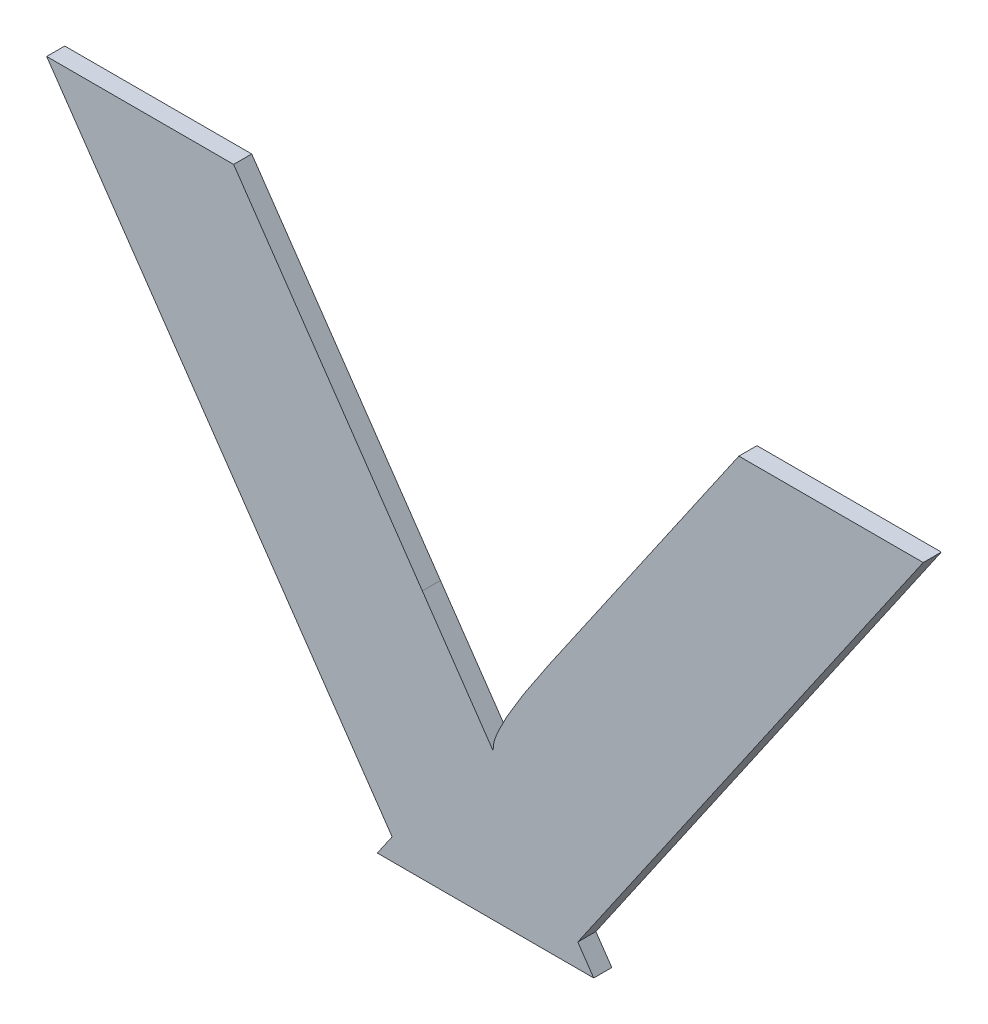
ISO-10303-21;
HEADER;
FILE_DESCRIPTION(('STEP AP214'),'2;1');
FILE_NAME('part.step','',(''),(''),'','','');
FILE_SCHEMA(('AUTOMOTIVE_DESIGN { 1 0 10303 214 1 1 1 1 }'));
ENDSEC;
DATA;
#1=APPLICATION_CONTEXT('core data for automotive mechanical design processes');
#2=APPLICATION_PROTOCOL_DEFINITION('international standard','automotive_design',2000,#1);
#3=PRODUCT_CONTEXT('',#1,'mechanical');
#4=PRODUCT('Part','Part','',(#3));
#5=PRODUCT_RELATED_PRODUCT_CATEGORY('part','',(#4));
#6=PRODUCT_DEFINITION_FORMATION('','',#4);
#7=PRODUCT_DEFINITION_CONTEXT('part definition',#1,'design');
#8=PRODUCT_DEFINITION('design','',#6,#7);
#9=PRODUCT_DEFINITION_SHAPE('','',#8);
#10=(LENGTH_UNIT() NAMED_UNIT(*) SI_UNIT(.MILLI.,.METRE.));
#11=(NAMED_UNIT(*) PLANE_ANGLE_UNIT() SI_UNIT($,.RADIAN.));
#12=(NAMED_UNIT(*) SI_UNIT($,.STERADIAN.) SOLID_ANGLE_UNIT());
#13=UNCERTAINTY_MEASURE_WITH_UNIT(LENGTH_MEASURE(1.E-05),#10,'distance_accuracy_value','');
#14=(GEOMETRIC_REPRESENTATION_CONTEXT(3) GLOBAL_UNCERTAINTY_ASSIGNED_CONTEXT((#13)) GLOBAL_UNIT_ASSIGNED_CONTEXT((#10,
#11,#12)) REPRESENTATION_CONTEXT('',''));
#15=CARTESIAN_POINT('',(0.,0.,0.));
#16=DIRECTION('',(0.,0.,1.));
#17=DIRECTION('',(1.,0.,0.));
#18=AXIS2_PLACEMENT_3D('',#15,#16,#17);
#19=CARTESIAN_POINT('',(13.6658653846154,-15.,0.5));
#20=DIRECTION('',(-0.824274658722889,-0.566190150909803,0.));
#21=DIRECTION('',(0.566190150909803,-0.824274658722889,0.));
#22=AXIS2_PLACEMENT_3D('',#19,#20,#21);
#23=PLANE('',#22);
#24=DIRECTION('',(-0.566190150909803,0.824274658722889,0.));
#25=VECTOR('',#24,1.);
#26=CARTESIAN_POINT('',(13.6658653846154,-15.,0.5));
#27=LINE('',#26,#25);
#28=CARTESIAN_POINT('',(3.01899271149552,0.499999999999999,0.5));
#29=VERTEX_POINT('',#28);
#30=CARTESIAN_POINT('',(2.57812500000002,1.14182692307692,0.5));
#31=VERTEX_POINT('',#30);
#32=EDGE_CURVE('E140',#29,#31,#27,.T.);
#33=ORIENTED_EDGE('',*,*,#32,.F.);
#34=DIRECTION('',(0.,0.,-1.));
#35=VECTOR('',#34,1.);
#36=CARTESIAN_POINT('',(3.01899271149552,0.5,0.5));
#37=LINE('',#36,#35);
#38=CARTESIAN_POINT('',(3.01899271149552,0.500000000000001,0.));
#39=VERTEX_POINT('',#38);
#40=EDGE_CURVE('E53',#29,#39,#37,.T.);
#41=ORIENTED_EDGE('',*,*,#40,.T.);
#42=DIRECTION('',(-0.566190150909803,0.824274658722889,0.));
#43=VECTOR('',#42,1.);
#44=CARTESIAN_POINT('',(13.6658653846154,-15.,0.));
#45=LINE('',#44,#43);
#46=CARTESIAN_POINT('',(2.57812500000002,1.14182692307692,0.));
#47=VERTEX_POINT('',#46);
#48=EDGE_CURVE('E131',#39,#47,#45,.T.);
#49=ORIENTED_EDGE('',*,*,#48,.T.);
#50=DIRECTION('',(0.,0.,-1.));
#51=VECTOR('',#50,1.);
#52=CARTESIAN_POINT('',(2.57812500000002,1.14182692307692,0.5));
#53=LINE('',#52,#51);
#54=EDGE_CURVE('E205',#31,#47,#53,.T.);
#55=ORIENTED_EDGE('',*,*,#54,.F.);
#56=EDGE_LOOP('',(#33,#41,#49,#55));
#57=FACE_BOUND('',#56,.T.);
#58=ADVANCED_FACE('F39',(#57),#23,.F.);
#59=CARTESIAN_POINT('',(-2.55408653846152,1.09375,0.5));
#60=DIRECTION('',(0.823485253579456,-0.567337674702799,0.));
#61=DIRECTION('',(0.567337674702799,0.823485253579456,0.));
#62=AXIS2_PLACEMENT_3D('',#59,#60,#61);
#63=PLANE('',#62);
#64=DIRECTION('',(-0.567337674702799,-0.823485253579456,0.));
#65=VECTOR('',#64,1.);
#66=CARTESIAN_POINT('',(-2.55408653846152,1.09375,0.));
#67=LINE('',#66,#65);
#68=CARTESIAN_POINT('',(-2.55408653846152,1.09375,0.));
#69=VERTEX_POINT('',#68);
#70=CARTESIAN_POINT('',(-2.9631488050784,0.500000000000001,0.));
#71=VERTEX_POINT('',#70);
#72=EDGE_CURVE('E125',#69,#71,#67,.T.);
#73=ORIENTED_EDGE('',*,*,#72,.T.);
#74=DIRECTION('',(0.,0.,1.));
#75=VECTOR('',#74,1.);
#76=CARTESIAN_POINT('',(-2.9631488050784,0.5,0.5));
#77=LINE('',#76,#75);
#78=CARTESIAN_POINT('',(-2.9631488050784,0.5,0.5));
#79=VERTEX_POINT('',#78);
#80=EDGE_CURVE('E113',#71,#79,#77,.T.);
#81=ORIENTED_EDGE('',*,*,#80,.T.);
#82=DIRECTION('',(-0.567337674702799,-0.823485253579456,0.));
#83=VECTOR('',#82,1.);
#84=CARTESIAN_POINT('',(-2.55408653846152,1.09375,0.5));
#85=LINE('',#84,#83);
#86=CARTESIAN_POINT('',(-2.55408653846152,1.09375,0.5));
#87=VERTEX_POINT('',#86);
#88=EDGE_CURVE('E139',#87,#79,#85,.T.);
#89=ORIENTED_EDGE('',*,*,#88,.F.);
#90=DIRECTION('',(0.,0.,-1.));
#91=VECTOR('',#90,1.);
#92=CARTESIAN_POINT('',(-2.55408653846152,1.09375,0.5));
#93=LINE('',#92,#91);
#94=EDGE_CURVE('E121',#87,#69,#93,.T.);
#95=ORIENTED_EDGE('',*,*,#94,.T.);
#96=EDGE_LOOP('',(#73,#81,#89,#95));
#97=FACE_BOUND('',#96,.T.);
#98=ADVANCED_FACE('F133',(#97),#63,.F.);
#99=CARTESIAN_POINT('',(0.897132594726207,6.02978446737757,0.5));
#100=DIRECTION('',(0.,0.,-1.));
#101=DIRECTION('',(-1.,0.,0.));
#102=AXIS2_PLACEMENT_3D('',#99,#100,#101);
#103=PLANE('',#102);
#104=ORIENTED_EDGE('',*,*,#88,.T.);
#105=DIRECTION('',(1.,0.,0.));
#106=VECTOR('',#105,1.);
#107=CARTESIAN_POINT('',(0.897132594726207,0.5,0.5));
#108=LINE('',#107,#106);
#109=EDGE_CURVE('E120',#79,#29,#108,.T.);
#110=ORIENTED_EDGE('',*,*,#109,.T.);
#111=ORIENTED_EDGE('',*,*,#32,.T.);
#112=DIRECTION('',(0.567407478147827,0.823437158344171,0.));
#113=VECTOR('',#112,1.);
#114=CARTESIAN_POINT('',(2.57812500000002,1.14182692307692,0.5));
#115=LINE('',#114,#113);
#116=CARTESIAN_POINT('',(12.1274038461539,15.,0.5));
#117=VERTEX_POINT('',#116);
#118=EDGE_CURVE('E137',#31,#117,#115,.T.);
#119=ORIENTED_EDGE('',*,*,#118,.T.);
#120=DIRECTION('',(-1.,0.,0.));
#121=VECTOR('',#120,1.);
#122=CARTESIAN_POINT('',(12.1274038461539,15.,0.5));
#123=LINE('',#122,#121);
#124=CARTESIAN_POINT('',(7.03125000000002,15.,0.5));
#125=VERTEX_POINT('',#124);
#126=EDGE_CURVE('E144',#117,#125,#123,.T.);
#127=ORIENTED_EDGE('',*,*,#126,.T.);
#128=DIRECTION('',(-0.567413224644085,-0.823433198565009,0.));
#129=VECTOR('',#128,1.);
#130=CARTESIAN_POINT('',(7.03125000000002,15.,0.5));
#131=LINE('',#130,#129);
#132=CARTESIAN_POINT('',(1.79687500000002,7.40384615384615,0.5));
#133=VERTEX_POINT('',#132);
#134=EDGE_CURVE('E150',#125,#133,#131,.T.);
#135=ORIENTED_EDGE('',*,*,#134,.T.);
#136=CARTESIAN_POINT('',(1.79687500000002,7.40384615384615,0.5));
#137=CARTESIAN_POINT('',(1.66835872417766,7.21376008798014,0.5));
#138=CARTESIAN_POINT('',(1.42719367381093,6.85705728629021,0.5));
#139=CARTESIAN_POINT('',(1.09194831290707,6.35109838499744,0.5));
#140=CARTESIAN_POINT('',(0.818953660033469,5.90206585669886,0.5));
#141=CARTESIAN_POINT('',(0.590733020491014,5.51645978922536,0.5));
#142=CARTESIAN_POINT('',(0.424619236532774,5.18798769434665,0.5));
#143=CARTESIAN_POINT('',(0.303286718756958,4.92271251016924,0.5));
#144=CARTESIAN_POINT('',(0.241039557624527,4.71248304513045,0.5));
#145=CARTESIAN_POINT('',(0.240571503028956,4.591554360704,0.5));
#146=CARTESIAN_POINT('',(0.240384615384632,4.54326923076923,0.5));
#147=B_SPLINE_CURVE_WITH_KNOTS('',3,(#136,#137,#138,#139,#140,#141,#142,#143,#144,#145,#146),
.UNSPECIFIED.,.F.,.F.,(4,1,1,1,1,1,1,1,4),(0.,0.209538372310658,0.393205699345931,
0.554151122843177,0.68938178712767,0.802279614558374,0.889951550348142,0.956059195419496,1.),.UNSPECIFIED.);
#148=CARTESIAN_POINT('',(0.240384615384632,4.54326923076923,0.5));
#149=VERTEX_POINT('',#148);
#150=EDGE_CURVE('E146',#133,#149,#147,.T.);
#151=ORIENTED_EDGE('',*,*,#150,.T.);
#152=CARTESIAN_POINT('',(0.240384615384632,4.54326923076923,0.5));
#153=CARTESIAN_POINT('',(0.112073046534497,4.7294942475537,0.5));
#154=CARTESIAN_POINT('',(-0.169135601242784,5.13762646526065,0.5));
#155=CARTESIAN_POINT('',(-0.622821441907052,5.8014022624845,0.5));
#156=CARTESIAN_POINT('',(-1.14707480618907,6.56702917955246,0.5));
#157=CARTESIAN_POINT('',(-1.52031592299236,7.10945514073589,0.5));
#158=CARTESIAN_POINT('',(-1.71874999999998,7.39783653846154,0.5));
#159=B_SPLINE_CURVE_WITH_KNOTS('',3,(#152,#153,#154,#155,#156,#157,#158),.UNSPECIFIED.,.F.,.F.,
(4,1,1,1,4),(0.,0.195959094056951,0.429465498343163,0.696674663801977,1.),.UNSPECIFIED.);
#160=CARTESIAN_POINT('',(-1.71874999999998,7.39783653846154,0.5));
#161=VERTEX_POINT('',#160);
#162=EDGE_CURVE('E151',#149,#161,#159,.T.);
#163=ORIENTED_EDGE('',*,*,#162,.T.);
#164=DIRECTION('',(-0.565781674534606,0.824555090191563,0.));
#165=VECTOR('',#164,1.);
#166=CARTESIAN_POINT('',(-1.71874999999998,7.39783653846154,0.5));
#167=LINE('',#166,#165);
#168=CARTESIAN_POINT('',(-6.93509615384614,15.,0.5));
#169=VERTEX_POINT('',#168);
#170=EDGE_CURVE('E246',#161,#169,#167,.T.);
#171=ORIENTED_EDGE('',*,*,#170,.T.);
#172=DIRECTION('',(-1.,0.,0.));
#173=VECTOR('',#172,1.);
#174=CARTESIAN_POINT('',(-6.93509615384614,15.,0.5));
#175=LINE('',#174,#173);
#176=CARTESIAN_POINT('',(-12.1033653846154,15.,0.5));
#177=VERTEX_POINT('',#176);
#178=EDGE_CURVE('E210',#169,#177,#175,.T.);
#179=ORIENTED_EDGE('',*,*,#178,.T.);
#180=DIRECTION('',(0.566075161043067,-0.824353632884617,0.));
#181=VECTOR('',#180,1.);
#182=CARTESIAN_POINT('',(-12.1033653846154,15.,0.5));
#183=LINE('',#182,#181);
#184=EDGE_CURVE('E207',#177,#87,#183,.T.);
#185=ORIENTED_EDGE('',*,*,#184,.T.);
#186=EDGE_LOOP('',(#104,#110,#111,#119,#127,#135,#151,#163,#171,#179,#185));
#187=FACE_BOUND('',#186,.T.);
#188=ADVANCED_FACE('F187',(#187),#103,.F.);
#189=CARTESIAN_POINT('',(2.57812500000002,1.14182692307692,0.5));
#190=DIRECTION('',(-0.823437158344171,0.567407478147827,0.));
#191=DIRECTION('',(-0.567407478147827,-0.823437158344171,0.));
#192=AXIS2_PLACEMENT_3D('',#189,#190,#191);
#193=PLANE('',#192);
#194=DIRECTION('',(0.567407478147827,0.823437158344171,0.));
#195=VECTOR('',#194,1.);
#196=CARTESIAN_POINT('',(2.57812500000002,1.14182692307692,0.));
#197=LINE('',#196,#195);
#198=CARTESIAN_POINT('',(12.1274038461539,15.,0.));
#199=VERTEX_POINT('',#198);
#200=EDGE_CURVE('E213',#47,#199,#197,.T.);
#201=ORIENTED_EDGE('',*,*,#200,.T.);
#202=DIRECTION('',(0.,0.,-1.));
#203=VECTOR('',#202,1.);
#204=CARTESIAN_POINT('',(12.1274038461539,15.,0.5));
#205=LINE('',#204,#203);
#206=EDGE_CURVE('E241',#117,#199,#205,.T.);
#207=ORIENTED_EDGE('',*,*,#206,.F.);
#208=ORIENTED_EDGE('',*,*,#118,.F.);
#209=ORIENTED_EDGE('',*,*,#54,.T.);
#210=EDGE_LOOP('',(#201,#207,#208,#209));
#211=FACE_BOUND('',#210,.T.);
#212=ADVANCED_FACE('F192',(#211),#193,.F.);
#213=CARTESIAN_POINT('',(12.1274038461539,15.,0.5));
#214=DIRECTION('',(0.,-1.,0.));
#215=DIRECTION('',(0.,0.,-1.));
#216=AXIS2_PLACEMENT_3D('',#213,#214,#215);
#217=PLANE('',#216);
#218=DIRECTION('',(-1.,0.,0.));
#219=VECTOR('',#218,1.);
#220=CARTESIAN_POINT('',(12.1274038461539,15.,0.));
#221=LINE('',#220,#219);
#222=CARTESIAN_POINT('',(7.03125000000002,15.,0.));
#223=VERTEX_POINT('',#222);
#224=EDGE_CURVE('E243',#199,#223,#221,.T.);
#225=ORIENTED_EDGE('',*,*,#224,.T.);
#226=DIRECTION('',(0.,0.,-1.));
#227=VECTOR('',#226,1.);
#228=CARTESIAN_POINT('',(7.03125000000002,15.,0.5));
#229=LINE('',#228,#227);
#230=EDGE_CURVE('E239',#125,#223,#229,.T.);
#231=ORIENTED_EDGE('',*,*,#230,.F.);
#232=ORIENTED_EDGE('',*,*,#126,.F.);
#233=ORIENTED_EDGE('',*,*,#206,.T.);
#234=EDGE_LOOP('',(#225,#231,#232,#233));
#235=FACE_BOUND('',#234,.T.);
#236=ADVANCED_FACE('F280',(#235),#217,.F.);
#237=CARTESIAN_POINT('',(7.03125000000002,15.,0.5));
#238=DIRECTION('',(0.823433198565009,-0.567413224644085,0.));
#239=DIRECTION('',(0.567413224644085,0.823433198565009,0.));
#240=AXIS2_PLACEMENT_3D('',#237,#238,#239);
#241=PLANE('',#240);
#242=DIRECTION('',(-0.567413224644085,-0.823433198565009,0.));
#243=VECTOR('',#242,1.);
#244=CARTESIAN_POINT('',(7.03125000000002,15.,0.));
#245=LINE('',#244,#243);
#246=CARTESIAN_POINT('',(1.79687500000002,7.40384615384615,0.));
#247=VERTEX_POINT('',#246);
#248=EDGE_CURVE('E236',#223,#247,#245,.T.);
#249=ORIENTED_EDGE('',*,*,#248,.T.);
#250=DIRECTION('',(0.,0.,-1.));
#251=VECTOR('',#250,1.);
#252=CARTESIAN_POINT('',(1.79687500000002,7.40384615384615,0.5));
#253=LINE('',#252,#251);
#254=EDGE_CURVE('E229',#133,#247,#253,.T.);
#255=ORIENTED_EDGE('',*,*,#254,.F.);
#256=ORIENTED_EDGE('',*,*,#134,.F.);
#257=ORIENTED_EDGE('',*,*,#230,.T.);
#258=EDGE_LOOP('',(#249,#255,#256,#257));
#259=FACE_BOUND('',#258,.T.);
#260=ADVANCED_FACE('F166',(#259),#241,.F.);
#261=DIRECTION('',(0.,0.,-1.));
#262=VECTOR('',#261,1.);
#263=SURFACE_OF_LINEAR_EXTRUSION('',#147,#262);
#264=CARTESIAN_POINT('',(1.79687500000002,7.40384615384615,0.));
#265=CARTESIAN_POINT('',(1.66835872417766,7.21376008798014,0.));
#266=CARTESIAN_POINT('',(1.42719367381093,6.85705728629021,0.));
#267=CARTESIAN_POINT('',(1.09194831290707,6.35109838499744,0.));
#268=CARTESIAN_POINT('',(0.818953660033469,5.90206585669886,0.));
#269=CARTESIAN_POINT('',(0.590733020491014,5.51645978922536,0.));
#270=CARTESIAN_POINT('',(0.424619236532774,5.18798769434665,0.));
#271=CARTESIAN_POINT('',(0.303286718756958,4.92271251016924,0.));
#272=CARTESIAN_POINT('',(0.241039557624527,4.71248304513045,0.));
#273=CARTESIAN_POINT('',(0.240571503028956,4.591554360704,0.));
#274=CARTESIAN_POINT('',(0.240384615384632,4.54326923076923,0.));
#275=B_SPLINE_CURVE_WITH_KNOTS('',3,(#264,#265,#266,#267,#268,#269,#270,#271,#272,#273,#274),
.UNSPECIFIED.,.F.,.F.,(4,1,1,1,1,1,1,1,4),(0.,0.209538372310658,0.393205699345931,
0.554151122843177,0.68938178712767,0.802279614558374,0.889951550348142,0.956059195419496,1.),.UNSPECIFIED.);
#276=CARTESIAN_POINT('',(0.240384615384632,4.54326923076923,0.));
#277=VERTEX_POINT('',#276);
#278=EDGE_CURVE('E231',#247,#277,#275,.T.);
#279=ORIENTED_EDGE('',*,*,#278,.T.);
#280=DIRECTION('',(0.,0.,-1.));
#281=VECTOR('',#280,1.);
#282=CARTESIAN_POINT('',(0.240384615384632,4.54326923076923,0.5));
#283=LINE('',#282,#281);
#284=EDGE_CURVE('E224',#149,#277,#283,.T.);
#285=ORIENTED_EDGE('',*,*,#284,.F.);
#286=ORIENTED_EDGE('',*,*,#150,.F.);
#287=ORIENTED_EDGE('',*,*,#254,.T.);
#288=EDGE_LOOP('',(#279,#285,#286,#287));
#289=FACE_BOUND('',#288,.T.);
#290=ADVANCED_FACE('F165',(#289),#263,.F.);
#291=DIRECTION('',(0.,0.,-1.));
#292=VECTOR('',#291,1.);
#293=SURFACE_OF_LINEAR_EXTRUSION('',#159,#292);
#294=CARTESIAN_POINT('',(0.240384615384632,4.54326923076923,0.));
#295=CARTESIAN_POINT('',(0.112073046534497,4.7294942475537,0.));
#296=CARTESIAN_POINT('',(-0.169135601242784,5.13762646526065,0.));
#297=CARTESIAN_POINT('',(-0.622821441907052,5.8014022624845,0.));
#298=CARTESIAN_POINT('',(-1.14707480618907,6.56702917955246,0.));
#299=CARTESIAN_POINT('',(-1.52031592299236,7.10945514073589,0.));
#300=CARTESIAN_POINT('',(-1.71874999999998,7.39783653846154,0.));
#301=B_SPLINE_CURVE_WITH_KNOTS('',3,(#294,#295,#296,#297,#298,#299,#300),.UNSPECIFIED.,.F.,.F.,
(4,1,1,1,4),(0.,0.195959094056951,0.429465498343163,0.696674663801977,1.),.UNSPECIFIED.);
#302=CARTESIAN_POINT('',(-1.71874999999998,7.39783653846154,0.));
#303=VERTEX_POINT('',#302);
#304=EDGE_CURVE('E226',#277,#303,#301,.T.);
#305=ORIENTED_EDGE('',*,*,#304,.T.);
#306=DIRECTION('',(0.,0.,-1.));
#307=VECTOR('',#306,1.);
#308=CARTESIAN_POINT('',(-1.71874999999998,7.39783653846154,0.5));
#309=LINE('',#308,#307);
#310=EDGE_CURVE('E225',#161,#303,#309,.T.);
#311=ORIENTED_EDGE('',*,*,#310,.F.);
#312=ORIENTED_EDGE('',*,*,#162,.F.);
#313=ORIENTED_EDGE('',*,*,#284,.T.);
#314=EDGE_LOOP('',(#305,#311,#312,#313));
#315=FACE_BOUND('',#314,.T.);
#316=ADVANCED_FACE('F167',(#315),#293,.F.);
#317=CARTESIAN_POINT('',(-1.71874999999998,7.39783653846154,0.5));
#318=DIRECTION('',(-0.824555090191563,-0.565781674534606,0.));
#319=DIRECTION('',(0.565781674534606,-0.824555090191563,0.));
#320=AXIS2_PLACEMENT_3D('',#317,#318,#319);
#321=PLANE('',#320);
#322=DIRECTION('',(-0.565781674534606,0.824555090191563,0.));
#323=VECTOR('',#322,1.);
#324=CARTESIAN_POINT('',(-1.71874999999998,7.39783653846154,0.));
#325=LINE('',#324,#323);
#326=CARTESIAN_POINT('',(-6.93509615384614,15.,0.));
#327=VERTEX_POINT('',#326);
#328=EDGE_CURVE('E223',#303,#327,#325,.T.);
#329=ORIENTED_EDGE('',*,*,#328,.T.);
#330=DIRECTION('',(0.,0.,-1.));
#331=VECTOR('',#330,1.);
#332=CARTESIAN_POINT('',(-6.93509615384614,15.,0.5));
#333=LINE('',#332,#331);
#334=EDGE_CURVE('E219',#169,#327,#333,.T.);
#335=ORIENTED_EDGE('',*,*,#334,.F.);
#336=ORIENTED_EDGE('',*,*,#170,.F.);
#337=ORIENTED_EDGE('',*,*,#310,.T.);
#338=EDGE_LOOP('',(#329,#335,#336,#337));
#339=FACE_BOUND('',#338,.T.);
#340=ADVANCED_FACE('F171',(#339),#321,.F.);
#341=CARTESIAN_POINT('',(-6.93509615384614,15.,0.5));
#342=DIRECTION('',(0.,-1.,0.));
#343=DIRECTION('',(0.,0.,-1.));
#344=AXIS2_PLACEMENT_3D('',#341,#342,#343);
#345=PLANE('',#344);
#346=DIRECTION('',(-1.,0.,0.));
#347=VECTOR('',#346,1.);
#348=CARTESIAN_POINT('',(-6.93509615384614,15.,0.));
#349=LINE('',#348,#347);
#350=CARTESIAN_POINT('',(-12.1033653846154,15.,0.));
#351=VERTEX_POINT('',#350);
#352=EDGE_CURVE('E217',#327,#351,#349,.T.);
#353=ORIENTED_EDGE('',*,*,#352,.T.);
#354=DIRECTION('',(0.,0.,-1.));
#355=VECTOR('',#354,1.);
#356=CARTESIAN_POINT('',(-12.1033653846154,15.,0.5));
#357=LINE('',#356,#355);
#358=EDGE_CURVE('E48',#177,#351,#357,.T.);
#359=ORIENTED_EDGE('',*,*,#358,.F.);
#360=ORIENTED_EDGE('',*,*,#178,.F.);
#361=ORIENTED_EDGE('',*,*,#334,.T.);
#362=EDGE_LOOP('',(#353,#359,#360,#361));
#363=FACE_BOUND('',#362,.T.);
#364=ADVANCED_FACE('F180',(#363),#345,.F.);
#365=CARTESIAN_POINT('',(-12.1033653846154,15.,0.5));
#366=DIRECTION('',(0.824353632884617,0.566075161043067,0.));
#367=DIRECTION('',(-0.566075161043067,0.824353632884617,0.));
#368=AXIS2_PLACEMENT_3D('',#365,#366,#367);
#369=PLANE('',#368);
#370=DIRECTION('',(0.566075161043067,-0.824353632884617,0.));
#371=VECTOR('',#370,1.);
#372=CARTESIAN_POINT('',(-12.1033653846154,15.,0.));
#373=LINE('',#372,#371);
#374=EDGE_CURVE('E211',#351,#69,#373,.T.);
#375=ORIENTED_EDGE('',*,*,#374,.T.);
#376=ORIENTED_EDGE('',*,*,#94,.F.);
#377=ORIENTED_EDGE('',*,*,#184,.F.);
#378=ORIENTED_EDGE('',*,*,#358,.T.);
#379=EDGE_LOOP('',(#375,#376,#377,#378));
#380=FACE_BOUND('',#379,.T.);
#381=ADVANCED_FACE('F181',(#380),#369,.F.);
#382=CARTESIAN_POINT('',(0.897132594726207,6.02978446737757,0.));
#383=DIRECTION('',(0.,0.,-1.));
#384=DIRECTION('',(-1.,0.,0.));
#385=AXIS2_PLACEMENT_3D('',#382,#383,#384);
#386=PLANE('',#385);
#387=DIRECTION('',(1.,0.,0.));
#388=VECTOR('',#387,1.);
#389=CARTESIAN_POINT('',(0.897132594726207,0.5,0.));
#390=LINE('',#389,#388);
#391=EDGE_CURVE('E11',#71,#39,#390,.T.);
#392=ORIENTED_EDGE('',*,*,#391,.F.);
#393=ORIENTED_EDGE('',*,*,#72,.F.);
#394=ORIENTED_EDGE('',*,*,#374,.F.);
#395=ORIENTED_EDGE('',*,*,#352,.F.);
#396=ORIENTED_EDGE('',*,*,#328,.F.);
#397=ORIENTED_EDGE('',*,*,#304,.F.);
#398=ORIENTED_EDGE('',*,*,#278,.F.);
#399=ORIENTED_EDGE('',*,*,#248,.F.);
#400=ORIENTED_EDGE('',*,*,#224,.F.);
#401=ORIENTED_EDGE('',*,*,#200,.F.);
#402=ORIENTED_EDGE('',*,*,#48,.F.);
#403=EDGE_LOOP('',(#392,#393,#394,#395,#396,#397,#398,#399,#400,#401,#402));
#404=FACE_BOUND('',#403,.T.);
#405=ADVANCED_FACE('F41',(#404),#386,.T.);
#406=CARTESIAN_POINT('',(-17.,0.5,1.));
#407=DIRECTION('',(0.,1.,0.));
#408=DIRECTION('',(0.,0.,1.));
#409=AXIS2_PLACEMENT_3D('',#406,#407,#408);
#410=PLANE('',#409);
#411=ORIENTED_EDGE('',*,*,#109,.F.);
#412=ORIENTED_EDGE('',*,*,#80,.F.);
#413=ORIENTED_EDGE('',*,*,#391,.T.);
#414=ORIENTED_EDGE('',*,*,#40,.F.);
#415=EDGE_LOOP('',(#411,#412,#413,#414));
#416=FACE_BOUND('',#415,.T.);
#417=ADVANCED_FACE('F119',(#416),#410,.F.);
#418=CLOSED_SHELL('',(#58,#98,#188,#212,#236,#260,#290,#316,#340,#364,#381,#405,#417));
#419=MANIFOLD_SOLID_BREP('B2',#418);
#420=ADVANCED_BREP_SHAPE_REPRESENTATION('',(#18,#419),#14);
#421=SHAPE_DEFINITION_REPRESENTATION(#9,#420);
ENDSEC;
END-ISO-10303-21;
